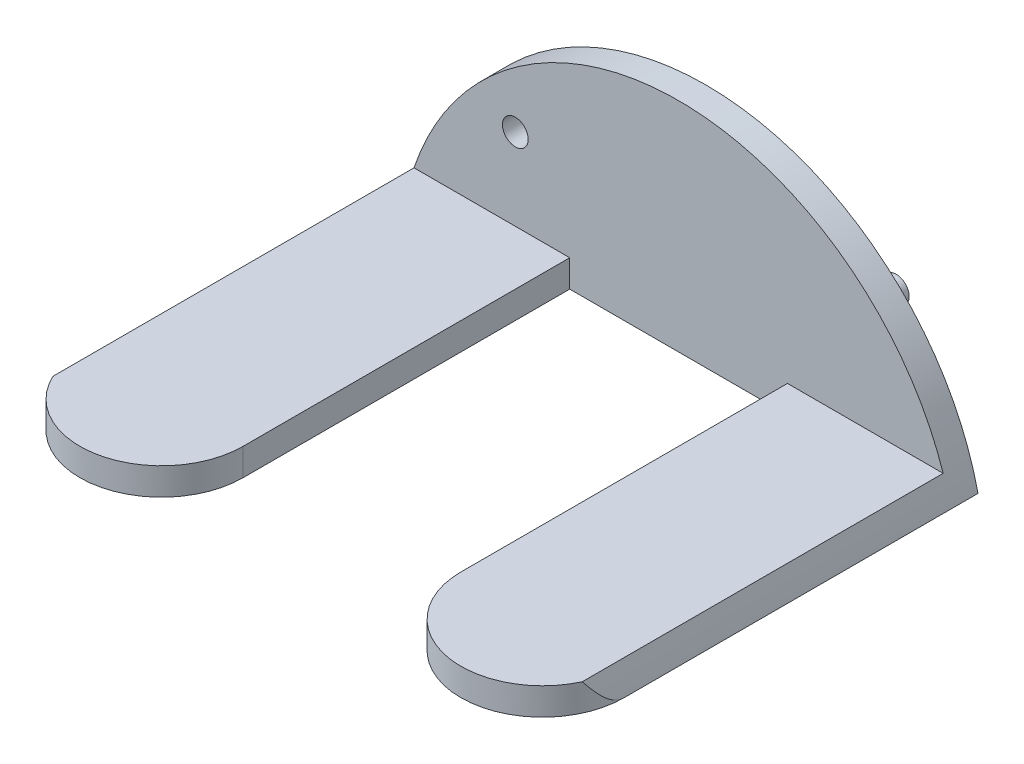
ISO-10303-21;
HEADER;
FILE_DESCRIPTION(('STEP AP214'),'2;1');
FILE_NAME('part.step','',(''),(''),'','','');
FILE_SCHEMA(('AUTOMOTIVE_DESIGN { 1 0 10303 214 1 1 1 1 }'));
ENDSEC;
DATA;
#1=APPLICATION_CONTEXT('core data for automotive mechanical design processes');
#2=APPLICATION_PROTOCOL_DEFINITION('international standard','automotive_design',2000,#1);
#3=PRODUCT_CONTEXT('',#1,'mechanical');
#4=PRODUCT('Part','Part','',(#3));
#5=PRODUCT_RELATED_PRODUCT_CATEGORY('part','',(#4));
#6=PRODUCT_DEFINITION_FORMATION('','',#4);
#7=PRODUCT_DEFINITION_CONTEXT('part definition',#1,'design');
#8=PRODUCT_DEFINITION('design','',#6,#7);
#9=PRODUCT_DEFINITION_SHAPE('','',#8);
#10=(LENGTH_UNIT() NAMED_UNIT(*) SI_UNIT(.MILLI.,.METRE.));
#11=(NAMED_UNIT(*) PLANE_ANGLE_UNIT() SI_UNIT($,.RADIAN.));
#12=(NAMED_UNIT(*) SI_UNIT($,.STERADIAN.) SOLID_ANGLE_UNIT());
#13=UNCERTAINTY_MEASURE_WITH_UNIT(LENGTH_MEASURE(1.E-05),#10,'distance_accuracy_value','');
#14=(GEOMETRIC_REPRESENTATION_CONTEXT(3) GLOBAL_UNCERTAINTY_ASSIGNED_CONTEXT((#13)) GLOBAL_UNIT_ASSIGNED_CONTEXT((#10,
#11,#12)) REPRESENTATION_CONTEXT('',''));
#15=CARTESIAN_POINT('',(0.,0.,0.));
#16=DIRECTION('',(0.,0.,1.));
#17=DIRECTION('',(1.,0.,0.));
#18=AXIS2_PLACEMENT_3D('',#15,#16,#17);
#19=CARTESIAN_POINT('',(63.5,3.17500000000001,3.175));
#20=DIRECTION('',(0.,-1.,0.));
#21=DIRECTION('',(0.,0.,-1.));
#22=AXIS2_PLACEMENT_3D('',#19,#20,#21);
#23=PLANE('',#22);
#24=CARTESIAN_POINT('',(53.975,3.175,41.275));
#25=DIRECTION('',(0.,1.,0.));
#26=DIRECTION('',(0.,0.,1.));
#27=AXIS2_PLACEMENT_3D('',#24,#25,#26);
#28=CIRCLE('',#27,9.52499999999998);
#29=CARTESIAN_POINT('',(62.6145275761674,3.175,45.2855097257883));
#30=VERTEX_POINT('',#29);
#31=CARTESIAN_POINT('',(44.45,3.175,41.275));
#32=VERTEX_POINT('',#31);
#33=EDGE_CURVE('E281',#30,#32,#28,.F.);
#34=ORIENTED_EDGE('',*,*,#33,.F.);
#35=DIRECTION('',(0.,0.,-1.));
#36=VECTOR('',#35,1.);
#37=CARTESIAN_POINT('',(62.6145275761674,3.17499999999999,50.8));
#38=LINE('',#37,#36);
#39=CARTESIAN_POINT('',(62.6145275761674,3.175,3.175));
#40=VERTEX_POINT('',#39);
#41=EDGE_CURVE('E279',#40,#30,#38,.F.);
#42=ORIENTED_EDGE('',*,*,#41,.F.);
#43=DIRECTION('',(-1.,0.,0.));
#44=VECTOR('',#43,1.);
#45=CARTESIAN_POINT('',(63.5,3.17500000000001,3.175));
#46=LINE('',#45,#44);
#47=CARTESIAN_POINT('',(44.45,3.17500000000001,3.175));
#48=VERTEX_POINT('',#47);
#49=EDGE_CURVE('E215',#40,#48,#46,.T.);
#50=ORIENTED_EDGE('',*,*,#49,.T.);
#51=DIRECTION('',(0.,0.,-1.));
#52=VECTOR('',#51,1.);
#53=CARTESIAN_POINT('',(44.45,3.17500000000001,0.));
#54=LINE('',#53,#52);
#55=EDGE_CURVE('E292',#32,#48,#54,.T.);
#56=ORIENTED_EDGE('',*,*,#55,.F.);
#57=EDGE_LOOP('',(#34,#42,#50,#56));
#58=FACE_BOUND('',#57,.T.);
#59=ADVANCED_FACE('F114',(#58),#23,.F.);
#60=DIRECTION('',(0.,0.,-1.));
#61=VECTOR('',#60,1.);
#62=CARTESIAN_POINT('',(0.885472423832565,3.17499999999999,50.8));
#63=LINE('',#62,#61);
#64=CARTESIAN_POINT('',(0.885472423832565,3.175,45.2855097257883));
#65=VERTEX_POINT('',#64);
#66=CARTESIAN_POINT('',(0.885472423832565,3.175,3.175));
#67=VERTEX_POINT('',#66);
#68=EDGE_CURVE('E299',#65,#67,#63,.T.);
#69=ORIENTED_EDGE('',*,*,#68,.F.);
#70=CARTESIAN_POINT('',(9.525,3.175,41.275));
#71=DIRECTION('',(0.,1.,0.));
#72=DIRECTION('',(0.,0.,1.));
#73=AXIS2_PLACEMENT_3D('',#70,#71,#72);
#74=CIRCLE('',#73,9.525);
#75=CARTESIAN_POINT('',(19.05,3.175,41.275));
#76=VERTEX_POINT('',#75);
#77=EDGE_CURVE('E199',#65,#76,#74,.T.);
#78=ORIENTED_EDGE('',*,*,#77,.T.);
#79=DIRECTION('',(0.,0.,-1.));
#80=VECTOR('',#79,1.);
#81=CARTESIAN_POINT('',(19.05,3.17500000000001,0.));
#82=LINE('',#81,#80);
#83=CARTESIAN_POINT('',(19.05,3.17500000000001,3.175));
#84=VERTEX_POINT('',#83);
#85=EDGE_CURVE('E286',#76,#84,#82,.T.);
#86=ORIENTED_EDGE('',*,*,#85,.T.);
#87=EDGE_CURVE('E208',#84,#67,#46,.T.);
#88=ORIENTED_EDGE('',*,*,#87,.T.);
#89=EDGE_LOOP('',(#69,#78,#86,#88));
#90=FACE_BOUND('',#89,.T.);
#91=ADVANCED_FACE('F250',(#90),#23,.F.);
#92=CARTESIAN_POINT('',(63.5,0.,50.8));
#93=DIRECTION('',(0.,1.,0.));
#94=DIRECTION('',(0.,0.,1.));
#95=AXIS2_PLACEMENT_3D('',#92,#93,#94);
#96=PLANE('',#95);
#97=CARTESIAN_POINT('',(9.525,0.,41.275));
#98=DIRECTION('',(0.,1.,0.));
#99=DIRECTION('',(0.,0.,1.));
#100=AXIS2_PLACEMENT_3D('',#97,#98,#99);
#101=CIRCLE('',#100,9.525);
#102=CARTESIAN_POINT('',(0.,0.,41.275));
#103=VERTEX_POINT('',#102);
#104=CARTESIAN_POINT('',(19.05,0.,41.275));
#105=VERTEX_POINT('',#104);
#106=EDGE_CURVE('E185',#103,#105,#101,.T.);
#107=ORIENTED_EDGE('',*,*,#106,.F.);
#108=DIRECTION('',(0.,0.,-1.));
#109=VECTOR('',#108,1.);
#110=CARTESIAN_POINT('',(0.,0.,50.8));
#111=LINE('',#110,#109);
#112=CARTESIAN_POINT('',(0.,0.,0.));
#113=VERTEX_POINT('',#112);
#114=EDGE_CURVE('E189',#103,#113,#111,.T.);
#115=ORIENTED_EDGE('',*,*,#114,.T.);
#116=DIRECTION('',(-1.,0.,0.));
#117=VECTOR('',#116,1.);
#118=CARTESIAN_POINT('',(63.5,0.,0.));
#119=LINE('',#118,#117);
#120=CARTESIAN_POINT('',(63.5,0.,0.));
#121=VERTEX_POINT('',#120);
#122=EDGE_CURVE('E218',#121,#113,#119,.T.);
#123=ORIENTED_EDGE('',*,*,#122,.F.);
#124=DIRECTION('',(0.,0.,-1.));
#125=VECTOR('',#124,1.);
#126=CARTESIAN_POINT('',(63.5,0.,50.8));
#127=LINE('',#126,#125);
#128=CARTESIAN_POINT('',(63.5,0.,41.275));
#129=VERTEX_POINT('',#128);
#130=EDGE_CURVE('E205',#129,#121,#127,.T.);
#131=ORIENTED_EDGE('',*,*,#130,.F.);
#132=CARTESIAN_POINT('',(53.975,0.,41.275));
#133=DIRECTION('',(0.,1.,0.));
#134=DIRECTION('',(0.,0.,1.));
#135=AXIS2_PLACEMENT_3D('',#132,#133,#134);
#136=CIRCLE('',#135,9.52499999999998);
#137=CARTESIAN_POINT('',(44.45,0.,41.275));
#138=VERTEX_POINT('',#137);
#139=EDGE_CURVE('E277',#129,#138,#136,.F.);
#140=ORIENTED_EDGE('',*,*,#139,.T.);
#141=DIRECTION('',(0.,0.,-1.));
#142=VECTOR('',#141,1.);
#143=CARTESIAN_POINT('',(44.45,0.,0.));
#144=LINE('',#143,#142);
#145=CARTESIAN_POINT('',(44.45,0.,3.17499999999999));
#146=VERTEX_POINT('',#145);
#147=EDGE_CURVE('E135',#138,#146,#144,.T.);
#148=ORIENTED_EDGE('',*,*,#147,.T.);
#149=DIRECTION('',(-1.,0.,0.));
#150=VECTOR('',#149,1.);
#151=CARTESIAN_POINT('',(0.,0.,3.17499999999999));
#152=LINE('',#151,#150);
#153=CARTESIAN_POINT('',(19.05,0.,3.17499999999999));
#154=VERTEX_POINT('',#153);
#155=EDGE_CURVE('E284',#146,#154,#152,.T.);
#156=ORIENTED_EDGE('',*,*,#155,.T.);
#157=DIRECTION('',(0.,0.,-1.));
#158=VECTOR('',#157,1.);
#159=CARTESIAN_POINT('',(19.05,0.,0.));
#160=LINE('',#159,#158);
#161=EDGE_CURVE('E192',#105,#154,#160,.T.);
#162=ORIENTED_EDGE('',*,*,#161,.F.);
#163=EDGE_LOOP('',(#107,#115,#123,#131,#140,#148,#156,#162));
#164=FACE_BOUND('',#163,.T.);
#165=ADVANCED_FACE('F116',(#164),#96,.F.);
#166=CARTESIAN_POINT('',(31.75,-7.14375000000001,50.8));
#167=DIRECTION('',(0.,0.,-1.));
#168=DIRECTION('',(0.,1.,0.));
#169=AXIS2_PLACEMENT_3D('',#166,#167,#168);
#170=CYLINDRICAL_SURFACE('',#169,32.54375);
#171=ORIENTED_EDGE('',*,*,#114,.F.);
#172=CARTESIAN_POINT('',(0.,0.,41.275));
#173=CARTESIAN_POINT('',(-5.9564295471509E-06,-3.36783453154461E-05,41.3419628270709));
#174=CARTESIAN_POINT('',(0.000706580643723809,0.00314088516689795,41.4088821494676));
#175=CARTESIAN_POINT('',(0.00351201289385096,0.0155955146000371,41.5420052646535));
#176=CARTESIAN_POINT('',(0.00560245899226981,0.0248647478582866,41.6082101155284));
#177=CARTESIAN_POINT('',(0.0137620591022296,0.0609345741404108,41.8028354007349));
#178=CARTESIAN_POINT('',(0.0217240212662134,0.0960213857201316,41.9296790295985));
#179=CARTESIAN_POINT('',(0.04605573153634,0.20196321731559,42.2266929391502));
#180=CARTESIAN_POINT('',(0.0645294052066173,0.281566973152709,42.3934592079187));
#181=CARTESIAN_POINT('',(0.107914485031292,0.464338983036182,42.7139572661023));
#182=CARTESIAN_POINT('',(0.13288377624588,0.567718095670587,42.8675544379062));
#183=CARTESIAN_POINT('',(0.198235695604735,0.831624266957192,43.2193066471993));
#184=CARTESIAN_POINT('',(0.240854766119954,0.998849859582442,43.4119151412779));
#185=CARTESIAN_POINT('',(0.333457123461265,1.34916736691107,43.7804386238537));
#186=CARTESIAN_POINT('',(0.383457153080651,1.53229495387405,43.9563141234602));
#187=CARTESIAN_POINT('',(0.489893557046144,1.90830294474116,44.2956084039503));
#188=CARTESIAN_POINT('',(0.546337942864195,2.1011953185696,44.4590112488688));
#189=CARTESIAN_POINT('',(0.665071416513261,2.49288650627721,44.7758360970199));
#190=CARTESIAN_POINT('',(0.727354828416363,2.69167945850221,44.9292675523693));
#191=CARTESIAN_POINT('',(0.807666759887889,2.93941022794634,45.1136416115639));
#192=CARTESIAN_POINT('',(0.823033970285644,2.98644758423703,45.1483499841477));
#193=CARTESIAN_POINT('',(0.8540413523282,3.08062538136673,45.2172746323901));
#194=CARTESIAN_POINT('',(0.86968086341526,3.12776538074958,45.2514918083006));
#195=CARTESIAN_POINT('',(0.885472423832566,3.175,45.2855097257883));
#196=B_SPLINE_CURVE_WITH_KNOTS('',3,(#172,#173,#174,#175,#176,#177,#178,#179,#180,#181,#182,
#183,#184,#185,#186,#187,#188,#189,#190,#191,#192,#193,#194,#195),.UNSPECIFIED.,.F.,.F.,(4,2,2,
2,2,2,2,2,2,2,2,4),(0.,0.200732845270486,0.401109869061923,0.794738277011704,1.34874695683658,
1.90787264581135,2.68176305925419,3.45743671904464,4.23408539928812,5.00998680150475,
5.19131440652468,5.37225073713104),.UNSPECIFIED.);
#197=EDGE_CURVE('E12',#103,#65,#196,.T.);
#198=ORIENTED_EDGE('',*,*,#197,.T.);
#199=ORIENTED_EDGE('',*,*,#68,.T.);
#200=CARTESIAN_POINT('',(31.75,-7.14375,3.17499999999999));
#201=DIRECTION('',(0.,0.,-1.));
#202=DIRECTION('',(0.,1.,0.));
#203=AXIS2_PLACEMENT_3D('',#200,#201,#202);
#204=CIRCLE('',#203,32.54375);
#205=EDGE_CURVE('E143',#67,#40,#204,.T.);
#206=ORIENTED_EDGE('',*,*,#205,.T.);
#207=ORIENTED_EDGE('',*,*,#41,.T.);
#208=CARTESIAN_POINT('',(63.5,0.,41.275));
#209=CARTESIAN_POINT('',(63.5000059564295,-3.36783452863253E-05,41.3419628270709));
#210=CARTESIAN_POINT('',(63.4992934193563,0.00314088516694179,41.4088821494676));
#211=CARTESIAN_POINT('',(63.4964879871061,0.0155955146000943,41.5420052646535));
#212=CARTESIAN_POINT('',(63.4943975410077,0.0248647478583425,41.6082101155284));
#213=CARTESIAN_POINT('',(63.4862379408978,0.0609345741404609,41.8028354007349));
#214=CARTESIAN_POINT('',(63.4782759787338,0.0960213857201753,41.9296790295985));
#215=CARTESIAN_POINT('',(63.4539442684637,0.201963217315635,42.2266929391502));
#216=CARTESIAN_POINT('',(63.4354705947934,0.281566973152768,42.3934592079187));
#217=CARTESIAN_POINT('',(63.3920855149687,0.464338983036235,42.7139572661023));
#218=CARTESIAN_POINT('',(63.3671162237541,0.56771809567062,42.8675544379062));
#219=CARTESIAN_POINT('',(63.3017643043953,0.831624266957201,43.2193066471993));
#220=CARTESIAN_POINT('',(63.25914523388,0.998849859582455,43.4119151412779));
#221=CARTESIAN_POINT('',(63.1665428765387,1.34916736691109,43.7804386238537));
#222=CARTESIAN_POINT('',(63.1165428469193,1.53229495387407,43.9563141234602));
#223=CARTESIAN_POINT('',(63.0101064429538,1.9083029447412,44.2956084039503));
#224=CARTESIAN_POINT('',(62.9536620571358,2.10119531856965,44.4590112488688));
#225=CARTESIAN_POINT('',(62.8349285834867,2.49288650627726,44.7758360970199));
#226=CARTESIAN_POINT('',(62.7726451715837,2.69167945850225,44.9292675523693));
#227=CARTESIAN_POINT('',(62.6923332401121,2.93941022794637,45.113641611564));
#228=CARTESIAN_POINT('',(62.6769660297143,2.98644758423706,45.1483499841477));
#229=CARTESIAN_POINT('',(62.6459586476718,3.08062538136674,45.2172746323901));
#230=CARTESIAN_POINT('',(62.6303191365847,3.12776538074958,45.2514918083006));
#231=CARTESIAN_POINT('',(62.6145275761674,3.17499999999999,45.2855097257883));
#232=B_SPLINE_CURVE_WITH_KNOTS('',3,(#208,#209,#210,#211,#212,#213,#214,#215,#216,#217,#218,
#219,#220,#221,#222,#223,#224,#225,#226,#227,#228,#229,#230,#231),.UNSPECIFIED.,.F.,.F.,(4,2,2,
2,2,2,2,2,2,2,2,4),(0.,0.200732845270482,0.40110986906192,0.794738277011711,1.34874695683658,
1.90787264581134,2.68176305925417,3.45743671904464,4.23408539928812,5.00998680150476,
5.19131440652466,5.37225073713099),.UNSPECIFIED.);
#233=EDGE_CURVE('E128',#129,#30,#232,.T.);
#234=ORIENTED_EDGE('',*,*,#233,.F.);
#235=ORIENTED_EDGE('',*,*,#130,.T.);
#236=CARTESIAN_POINT('',(31.75,-7.14375,0.));
#237=DIRECTION('',(0.,0.,-1.));
#238=DIRECTION('',(0.,1.,0.));
#239=AXIS2_PLACEMENT_3D('',#236,#237,#238);
#240=CIRCLE('',#239,32.54375);
#241=EDGE_CURVE('E203',#113,#121,#240,.T.);
#242=ORIENTED_EDGE('',*,*,#241,.F.);
#243=EDGE_LOOP('',(#171,#198,#199,#206,#207,#234,#235,#242));
#244=FACE_BOUND('',#243,.T.);
#245=ADVANCED_FACE('F201',(#244),#170,.T.);
#246=CARTESIAN_POINT('',(63.5,0.,0.));
#247=DIRECTION('',(0.,0.,1.));
#248=DIRECTION('',(1.,0.,0.));
#249=AXIS2_PLACEMENT_3D('',#246,#247,#248);
#250=PLANE('',#249);
#251=CARTESIAN_POINT('',(50.8,12.7,0.));
#252=DIRECTION('',(0.,0.,1.));
#253=DIRECTION('',(1.,0.,0.));
#254=AXIS2_PLACEMENT_3D('',#251,#252,#253);
#255=CIRCLE('',#254,1.5);
#256=CARTESIAN_POINT('',(52.3,12.7,0.));
#257=VERTEX_POINT('',#256);
#258=EDGE_CURVE('E219',#257,#257,#255,.F.);
#259=ORIENTED_EDGE('',*,*,#258,.F.);
#260=EDGE_LOOP('',(#259));
#261=FACE_BOUND('',#260,.T.);
#262=CARTESIAN_POINT('',(12.7,12.7,0.));
#263=DIRECTION('',(0.,0.,-1.));
#264=DIRECTION('',(0.,1.,0.));
#265=AXIS2_PLACEMENT_3D('',#262,#263,#264);
#266=CIRCLE('',#265,1.5);
#267=CARTESIAN_POINT('',(12.7,14.2,0.));
#268=VERTEX_POINT('',#267);
#269=EDGE_CURVE('E211',#268,#268,#266,.T.);
#270=ORIENTED_EDGE('',*,*,#269,.F.);
#271=EDGE_LOOP('',(#270));
#272=FACE_BOUND('',#271,.T.);
#273=ORIENTED_EDGE('',*,*,#122,.T.);
#274=ORIENTED_EDGE('',*,*,#241,.T.);
#275=EDGE_LOOP('',(#273,#274));
#276=FACE_BOUND('',#275,.T.);
#277=ADVANCED_FACE('F263',(#261,#272,#276),#250,.F.);
#278=CARTESIAN_POINT('',(63.5,25.4,3.175));
#279=DIRECTION('',(0.,0.,-1.));
#280=DIRECTION('',(0.,1.,0.));
#281=AXIS2_PLACEMENT_3D('',#278,#279,#280);
#282=PLANE('',#281);
#283=CARTESIAN_POINT('',(12.7,12.7,3.175));
#284=DIRECTION('',(0.,0.,-1.));
#285=DIRECTION('',(0.,1.,0.));
#286=AXIS2_PLACEMENT_3D('',#283,#284,#285);
#287=CIRCLE('',#286,1.5);
#288=CARTESIAN_POINT('',(12.7,14.2,3.175));
#289=VERTEX_POINT('',#288);
#290=EDGE_CURVE('E206',#289,#289,#287,.T.);
#291=ORIENTED_EDGE('',*,*,#290,.T.);
#292=EDGE_LOOP('',(#291));
#293=FACE_BOUND('',#292,.T.);
#294=ORIENTED_EDGE('',*,*,#205,.F.);
#295=ORIENTED_EDGE('',*,*,#87,.F.);
#296=DIRECTION('',(0.,1.,0.));
#297=VECTOR('',#296,1.);
#298=CARTESIAN_POINT('',(19.05,0.,3.17499999999999));
#299=LINE('',#298,#297);
#300=EDGE_CURVE('E300',#154,#84,#299,.T.);
#301=ORIENTED_EDGE('',*,*,#300,.F.);
#302=ORIENTED_EDGE('',*,*,#155,.F.);
#303=DIRECTION('',(0.,1.,0.));
#304=VECTOR('',#303,1.);
#305=CARTESIAN_POINT('',(44.45,0.,3.17499999999999));
#306=LINE('',#305,#304);
#307=EDGE_CURVE('E302',#146,#48,#306,.T.);
#308=ORIENTED_EDGE('',*,*,#307,.T.);
#309=ORIENTED_EDGE('',*,*,#49,.F.);
#310=EDGE_LOOP('',(#294,#295,#301,#302,#308,#309));
#311=FACE_BOUND('',#310,.T.);
#312=ADVANCED_FACE('F261',(#293,#311),#282,.F.);
#313=CARTESIAN_POINT('',(12.7,12.7,50.8));
#314=DIRECTION('',(0.,0.,-1.));
#315=DIRECTION('',(0.,1.,0.));
#316=AXIS2_PLACEMENT_3D('',#313,#314,#315);
#317=CYLINDRICAL_SURFACE('',#316,1.5);
#318=ORIENTED_EDGE('',*,*,#269,.T.);
#319=EDGE_LOOP('',(#318));
#320=FACE_BOUND('',#319,.T.);
#321=ORIENTED_EDGE('',*,*,#290,.F.);
#322=EDGE_LOOP('',(#321));
#323=FACE_BOUND('',#322,.T.);
#324=ADVANCED_FACE('F259',(#320,#323),#317,.F.);
#325=CARTESIAN_POINT('',(50.8,12.7,-3.175));
#326=DIRECTION('',(0.,0.,1.));
#327=DIRECTION('',(0.,-1.,0.));
#328=AXIS2_PLACEMENT_3D('',#325,#326,#327);
#329=CYLINDRICAL_SURFACE('',#328,1.5);
#330=CARTESIAN_POINT('',(50.8,12.7,-3.175));
#331=DIRECTION('',(0.,0.,-1.));
#332=DIRECTION('',(0.,1.,0.));
#333=AXIS2_PLACEMENT_3D('',#330,#331,#332);
#334=CIRCLE('',#333,1.5);
#335=CARTESIAN_POINT('',(50.8,14.2,-3.175));
#336=VERTEX_POINT('',#335);
#337=EDGE_CURVE('E309',#336,#336,#334,.T.);
#338=ORIENTED_EDGE('',*,*,#337,.F.);
#339=EDGE_LOOP('',(#338));
#340=FACE_BOUND('',#339,.T.);
#341=ORIENTED_EDGE('',*,*,#258,.T.);
#342=EDGE_LOOP('',(#341));
#343=FACE_BOUND('',#342,.T.);
#344=ADVANCED_FACE('F247',(#340,#343),#329,.T.);
#345=CARTESIAN_POINT('',(0.,0.,-3.175));
#346=DIRECTION('',(0.,0.,-1.));
#347=DIRECTION('',(0.,1.,0.));
#348=AXIS2_PLACEMENT_3D('',#345,#346,#347);
#349=PLANE('',#348);
#350=ORIENTED_EDGE('',*,*,#337,.T.);
#351=EDGE_LOOP('',(#350));
#352=FACE_BOUND('',#351,.T.);
#353=ADVANCED_FACE('F243',(#352),#349,.T.);
#354=CARTESIAN_POINT('',(9.525,0.,41.275));
#355=DIRECTION('',(0.,1.,0.));
#356=DIRECTION('',(0.,0.,1.));
#357=AXIS2_PLACEMENT_3D('',#354,#355,#356);
#358=CYLINDRICAL_SURFACE('',#357,9.525);
#359=ORIENTED_EDGE('',*,*,#77,.F.);
#360=ORIENTED_EDGE('',*,*,#197,.F.);
#361=ORIENTED_EDGE('',*,*,#106,.T.);
#362=DIRECTION('',(0.,1.,0.));
#363=VECTOR('',#362,1.);
#364=CARTESIAN_POINT('',(19.05,0.,41.275));
#365=LINE('',#364,#363);
#366=EDGE_CURVE('E297',#105,#76,#365,.T.);
#367=ORIENTED_EDGE('',*,*,#366,.T.);
#368=EDGE_LOOP('',(#359,#360,#361,#367));
#369=FACE_BOUND('',#368,.T.);
#370=ADVANCED_FACE('F197',(#369),#358,.T.);
#371=CARTESIAN_POINT('',(19.05,0.,0.));
#372=DIRECTION('',(1.,0.,0.));
#373=DIRECTION('',(0.,0.,-1.));
#374=AXIS2_PLACEMENT_3D('',#371,#372,#373);
#375=PLANE('',#374);
#376=ORIENTED_EDGE('',*,*,#85,.F.);
#377=ORIENTED_EDGE('',*,*,#366,.F.);
#378=ORIENTED_EDGE('',*,*,#161,.T.);
#379=ORIENTED_EDGE('',*,*,#300,.T.);
#380=EDGE_LOOP('',(#376,#377,#378,#379));
#381=FACE_BOUND('',#380,.T.);
#382=ADVANCED_FACE('F238',(#381),#375,.T.);
#383=CARTESIAN_POINT('',(44.45,0.,0.));
#384=DIRECTION('',(1.,0.,0.));
#385=DIRECTION('',(0.,0.,-1.));
#386=AXIS2_PLACEMENT_3D('',#383,#384,#385);
#387=PLANE('',#386);
#388=ORIENTED_EDGE('',*,*,#55,.T.);
#389=ORIENTED_EDGE('',*,*,#307,.F.);
#390=ORIENTED_EDGE('',*,*,#147,.F.);
#391=DIRECTION('',(0.,1.,0.));
#392=VECTOR('',#391,1.);
#393=CARTESIAN_POINT('',(44.45,0.,41.275));
#394=LINE('',#393,#392);
#395=EDGE_CURVE('E195',#138,#32,#394,.T.);
#396=ORIENTED_EDGE('',*,*,#395,.T.);
#397=EDGE_LOOP('',(#388,#389,#390,#396));
#398=FACE_BOUND('',#397,.T.);
#399=ADVANCED_FACE('F234',(#398),#387,.F.);
#400=CARTESIAN_POINT('',(53.975,0.,41.275));
#401=DIRECTION('',(0.,1.,0.));
#402=DIRECTION('',(0.,0.,1.));
#403=AXIS2_PLACEMENT_3D('',#400,#401,#402);
#404=CYLINDRICAL_SURFACE('',#403,9.52499999999998);
#405=ORIENTED_EDGE('',*,*,#33,.T.);
#406=ORIENTED_EDGE('',*,*,#395,.F.);
#407=ORIENTED_EDGE('',*,*,#139,.F.);
#408=ORIENTED_EDGE('',*,*,#233,.T.);
#409=EDGE_LOOP('',(#405,#406,#407,#408));
#410=FACE_BOUND('',#409,.T.);
#411=ADVANCED_FACE('F230',(#410),#404,.T.);
#412=CLOSED_SHELL('',(#59,#91,#165,#245,#277,#312,#324,#344,#353,#370,#382,#399,#411));
#413=MANIFOLD_SOLID_BREP('B2',#412);
#414=ADVANCED_BREP_SHAPE_REPRESENTATION('',(#18,#413),#14);
#415=SHAPE_DEFINITION_REPRESENTATION(#9,#414);
ENDSEC;
END-ISO-10303-21;
